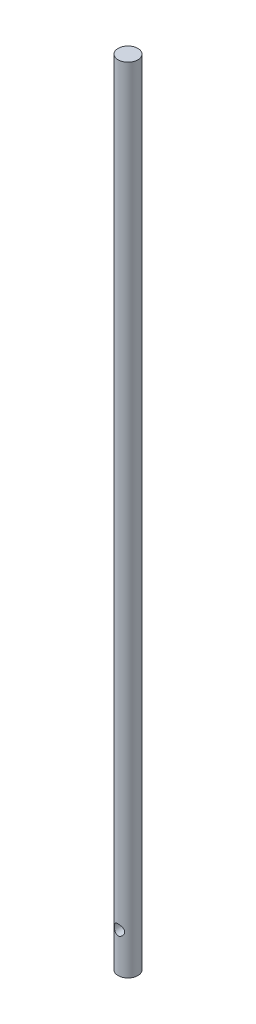
ISO-10303-21;
HEADER;
FILE_DESCRIPTION(('STEP AP214'),'2;1');
FILE_NAME('part.step','',(''),(''),'','','');
FILE_SCHEMA(('AUTOMOTIVE_DESIGN { 1 0 10303 214 1 1 1 1 }'));
ENDSEC;
DATA;
#1=APPLICATION_CONTEXT('core data for automotive mechanical design processes');
#2=APPLICATION_PROTOCOL_DEFINITION('international standard','automotive_design',2000,#1);
#3=PRODUCT_CONTEXT('',#1,'mechanical');
#4=PRODUCT('Part','Part','',(#3));
#5=PRODUCT_RELATED_PRODUCT_CATEGORY('part','',(#4));
#6=PRODUCT_DEFINITION_FORMATION('','',#4);
#7=PRODUCT_DEFINITION_CONTEXT('part definition',#1,'design');
#8=PRODUCT_DEFINITION('design','',#6,#7);
#9=PRODUCT_DEFINITION_SHAPE('','',#8);
#10=(LENGTH_UNIT() NAMED_UNIT(*) SI_UNIT(.MILLI.,.METRE.));
#11=(NAMED_UNIT(*) PLANE_ANGLE_UNIT() SI_UNIT($,.RADIAN.));
#12=(NAMED_UNIT(*) SI_UNIT($,.STERADIAN.) SOLID_ANGLE_UNIT());
#13=UNCERTAINTY_MEASURE_WITH_UNIT(LENGTH_MEASURE(1.E-05),#10,'distance_accuracy_value','');
#14=(GEOMETRIC_REPRESENTATION_CONTEXT(3) GLOBAL_UNCERTAINTY_ASSIGNED_CONTEXT((#13)) GLOBAL_UNIT_ASSIGNED_CONTEXT((#10,
#11,#12)) REPRESENTATION_CONTEXT('',''));
#15=CARTESIAN_POINT('',(0.,0.,0.));
#16=DIRECTION('',(0.,0.,1.));
#17=DIRECTION('',(1.,0.,0.));
#18=AXIS2_PLACEMENT_3D('',#15,#16,#17);
#19=CARTESIAN_POINT('',(0.,200.,0.));
#20=DIRECTION('',(0.,-1.,0.));
#21=DIRECTION('',(0.,0.,-1.));
#22=AXIS2_PLACEMENT_3D('',#19,#20,#21);
#23=CYLINDRICAL_SURFACE('',#22,2.5);
#24=CARTESIAN_POINT('',(0.,11.3,-2.5));
#25=CARTESIAN_POINT('',(-0.0680113695059631,11.2999955809797,-2.49999609902581));
#26=CARTESIAN_POINT('',(-0.136093788180356,11.2946316229765,-2.49719546987896));
#27=CARTESIAN_POINT('',(-0.270225454250748,11.273423033882,-2.48626765671663));
#28=CARTESIAN_POINT('',(-0.336271062711259,11.2575606668273,-2.47813145902996));
#29=CARTESIAN_POINT('',(-0.464188472425048,11.216154070548,-2.45737911115534));
#30=CARTESIAN_POINT('',(-0.526075766477188,11.1906484308444,-2.44478082944565));
#31=CARTESIAN_POINT('',(-0.644589209675041,11.1308906089619,-2.41624205813435));
#32=CARTESIAN_POINT('',(-0.701215505423523,11.0966386706068,-2.40030166170432));
#33=CARTESIAN_POINT('',(-0.81166759212663,11.0178831281098,-2.3653250117645));
#34=CARTESIAN_POINT('',(-0.865083381438265,10.9728643985277,-2.34615603866433));
#35=CARTESIAN_POINT('',(-0.963989056970096,10.8749705571644,-2.30728290736442));
#36=CARTESIAN_POINT('',(-1.00947237054757,10.8220889970174,-2.28757832084618));
#37=CARTESIAN_POINT('',(-1.09513753441025,10.7045584552035,-2.24790755636024));
#38=CARTESIAN_POINT('',(-1.13453247326665,10.639289699008,-2.22806332919205));
#39=CARTESIAN_POINT('',(-1.20162263947399,10.5019286437702,-2.19261300871779));
#40=CARTESIAN_POINT('',(-1.22932667033737,10.4298415293584,-2.17700372957641));
#41=CARTESIAN_POINT('',(-1.27036888654655,10.2853826193459,-2.15329918557366));
#42=CARTESIAN_POINT('',(-1.28448748494984,10.2133024027099,-2.1447999806986));
#43=CARTESIAN_POINT('',(-1.30032214599433,10.0673382991288,-2.13524197560196));
#44=CARTESIAN_POINT('',(-1.30205239339102,9.99345657226103,-2.13417466584282));
#45=CARTESIAN_POINT('',(-1.29363159633311,9.85649275191733,-2.13928164525275));
#46=CARTESIAN_POINT('',(-1.28501836836425,9.79327214308005,-2.14451886326309));
#47=CARTESIAN_POINT('',(-1.25884150775024,9.66934816643952,-2.15998772155474));
#48=CARTESIAN_POINT('',(-1.24127460315842,9.60864572762776,-2.17022118755991));
#49=CARTESIAN_POINT('',(-1.19739608727306,9.48975152758059,-2.19473990584834));
#50=CARTESIAN_POINT('',(-1.17089309730273,9.43164931861785,-2.20911272964634));
#51=CARTESIAN_POINT('',(-1.11004732855925,9.32042809671486,-2.24030417293869));
#52=CARTESIAN_POINT('',(-1.07570103709793,9.26731133163273,-2.2571238870646));
#53=CARTESIAN_POINT('',(-0.994600690710102,9.15981655563225,-2.29412683800401));
#54=CARTESIAN_POINT('',(-0.94678659795537,9.10628463283547,-2.31445310227271));
#55=CARTESIAN_POINT('',(-0.842817041578248,9.00762978696943,-2.35430677787375));
#56=CARTESIAN_POINT('',(-0.78665698079226,8.96251152943353,-2.3738337413228));
#57=CARTESIAN_POINT('',(-0.663774127410599,8.87965060642806,-2.41116994987061));
#58=CARTESIAN_POINT('',(-0.596644646812704,8.84243795998662,-2.4288294437478));
#59=CARTESIAN_POINT('',(-0.455930966123092,8.78015071661923,-2.45912356419007));
#60=CARTESIAN_POINT('',(-0.382352338507071,8.75506576037823,-2.47176247761752));
#61=CARTESIAN_POINT('',(-0.237696689390573,8.7199421707391,-2.48964687281174));
#62=CARTESIAN_POINT('',(-0.166960386836864,8.70878288196254,-2.49544064536842));
#63=CARTESIAN_POINT('',(-0.0243942042796414,8.6982683279208,-2.50089635599645));
#64=CARTESIAN_POINT('',(0.0474350713497855,8.69890676014066,-2.50056156803526));
#65=CARTESIAN_POINT('',(0.183618209438066,8.71137313423458,-2.49410050655221));
#66=CARTESIAN_POINT('',(0.248087136366193,8.72224207915056,-2.48847062394008));
#67=CARTESIAN_POINT('',(0.374141031441014,8.75331102944845,-2.47266151578169));
#68=CARTESIAN_POINT('',(0.435725691885608,8.77351202791539,-2.46248180606224));
#69=CARTESIAN_POINT('',(0.55618110520896,8.82313115942012,-2.43814302074764));
#70=CARTESIAN_POINT('',(0.614936096743494,8.85278017014389,-2.4238852987495));
#71=CARTESIAN_POINT('',(0.726817602279269,8.92018210792856,-2.39272108080907));
#72=CARTESIAN_POINT('',(0.779941812395783,8.95793833315712,-2.37581350761577));
#73=CARTESIAN_POINT('',(0.884925243858758,9.04499803288043,-2.33887075877338));
#74=CARTESIAN_POINT('',(0.936078033693247,9.09509413429453,-2.31869319367569));
#75=CARTESIAN_POINT('',(1.02959738484077,9.20310677159969,-2.27871043976582));
#76=CARTESIAN_POINT('',(1.07195663837658,9.26102974646841,-2.25890557300989));
#77=CARTESIAN_POINT('',(1.14910272035529,9.38733673410915,-2.22070397734203));
#78=CARTESIAN_POINT('',(1.18328973831135,9.45613791542058,-2.20246093456135));
#79=CARTESIAN_POINT('',(1.23924098239167,9.59975141512398,-2.17147835100918));
#80=CARTESIAN_POINT('',(1.26102233570193,9.67455528255512,-2.15873122854439));
#81=CARTESIAN_POINT('',(1.28943999012578,9.82027124591388,-2.14186687422015));
#82=CARTESIAN_POINT('',(1.29734839119878,9.89084921061157,-2.13702798664101));
#83=CARTESIAN_POINT('',(1.3015203399281,10.0324609798733,-2.13449180299613));
#84=CARTESIAN_POINT('',(1.29779049988741,10.1034945027235,-2.13679045171325));
#85=CARTESIAN_POINT('',(1.2800034542772,10.2356761059305,-2.14748109373078));
#86=CARTESIAN_POINT('',(1.26713384169057,10.2970487331319,-2.15517118633996));
#87=CARTESIAN_POINT('',(1.23298733247354,10.4166697799384,-2.17488587021126));
#88=CARTESIAN_POINT('',(1.21170751826452,10.4749171073746,-2.18691196554666));
#89=CARTESIAN_POINT('',(1.15979270017153,10.5909175599503,-2.21490467413759));
#90=CARTESIAN_POINT('',(1.12863261878603,10.6483839298456,-2.23107909446047));
#91=CARTESIAN_POINT('',(1.05838667201273,10.7576554103908,-2.2652468080127));
#92=CARTESIAN_POINT('',(1.01929655715553,10.8094574626985,-2.28324107383964));
#93=CARTESIAN_POINT('',(0.928121386241809,10.9132263220494,-2.3219301192689));
#94=CARTESIAN_POINT('',(0.874994006967033,10.9642688719206,-2.34266114669507));
#95=CARTESIAN_POINT('',(0.760430106723436,11.0569653962801,-2.38231377154673));
#96=CARTESIAN_POINT('',(0.698988646857169,11.09861375072,-2.40123428195996));
#97=CARTESIAN_POINT('',(0.567986350348215,11.1717994003664,-2.43558032718761));
#98=CARTESIAN_POINT('',(0.498306712219092,11.2031555742418,-2.45094198545967));
#99=CARTESIAN_POINT('',(0.353697863564509,11.2532825710194,-2.47593211426922));
#100=CARTESIAN_POINT('',(0.278783693118586,11.2720879357208,-2.48557631190442));
#101=CARTESIAN_POINT('',(0.169188039913598,11.2893907930656,-2.49449662438316));
#102=CARTESIAN_POINT('',(0.13551306404705,11.2933625590737,-2.49655400233432));
#103=CARTESIAN_POINT('',(0.067897966914962,11.2986682957714,-2.49930667952064));
#104=CARTESIAN_POINT('',(0.0339578396300279,11.3000022064014,-2.50000194774281));
#105=CARTESIAN_POINT('',(0.,11.3,-2.5));
#106=B_SPLINE_CURVE_WITH_KNOTS('',3,(#24,#25,#26,#27,#28,#29,#30,#31,#32,#33,#34,#35,#36,#37,
#38,#39,#40,#41,#42,#43,#44,#45,#46,#47,#48,#49,#50,#51,#52,#53,#54,#55,#56,#57,#58,#59,#60,#61,
#62,#63,#64,#65,#66,#67,#68,#69,#70,#71,#72,#73,#74,#75,#76,#77,#78,#79,#80,#81,#82,#83,#84,#85,
#86,#87,#88,#89,#90,#91,#92,#93,#94,#95,#96,#97,#98,#99,#100,#101,#102,#103,#104,#105),
.UNSPECIFIED.,.T.,.F.,(4,2,2,2,2,2,2,2,2,2,2,2,2,2,2,2,2,2,2,2,2,2,2,2,2,2,2,2,2,2,2,2,2,2,2,2,
2,2,2,2,4),(0.,0.203896806366285,0.408138957322479,0.611572296877393,0.814999965865628,
1.03142326439271,1.24802504237353,1.48316517792176,1.71812793040786,1.93860407014476,
2.15882772260557,2.34998891208855,2.54122000784162,2.73683841649128,2.9325446069,
3.15538331852189,3.37834523326736,3.6133502261928,3.84815412468367,4.06249724663536,
4.27672586667119,4.47268293759257,4.66866086639621,4.86985169558171,5.07112452858474,
5.2933343320654,5.51572806791228,5.75134168970872,5.98662923131482,6.19892188281192,
6.41109394154319,6.599804305942,6.78858019329843,6.98982480284757,7.19117753962887,
7.4197479326573,7.64845470667187,7.88099383218265,8.1128903049696,8.21469295152371,
8.31649791592829),.UNSPECIFIED.);
#107=CARTESIAN_POINT('',(0.,11.3,-2.5));
#108=VERTEX_POINT('',#107);
#109=EDGE_CURVE('E10',#108,#108,#106,.T.);
#110=ORIENTED_EDGE('',*,*,#109,.T.);
#111=EDGE_LOOP('',(#110));
#112=FACE_BOUND('',#111,.T.);
#113=CARTESIAN_POINT('',(1.3,10.,2.13541565040627));
#114=CARTESIAN_POINT('',(1.29999499202181,9.93269100075459,2.13542218510378));
#115=CARTESIAN_POINT('',(1.29473701672371,9.86530685608975,2.13864723650628));
#116=CARTESIAN_POINT('',(1.27398927979969,9.73264180439464,2.15106664383973));
#117=CARTESIAN_POINT('',(1.25847975439629,9.66736521594842,2.1602725295249));
#118=CARTESIAN_POINT('',(1.21810181079737,9.54108954043734,2.18329096498212));
#119=CARTESIAN_POINT('',(1.19328638783913,9.48006850959343,2.19707737979651));
#120=CARTESIAN_POINT('',(1.13516352123659,9.36307323514826,2.22766227770051));
#121=CARTESIAN_POINT('',(1.10185505167651,9.30709960235286,2.24446112460342));
#122=CARTESIAN_POINT('',(1.02419532044111,9.19625635015196,2.2810137465525));
#123=CARTESIAN_POINT('',(0.979121896827735,9.14193530864805,2.30089741785951));
#124=CARTESIAN_POINT('',(0.880709450271071,9.04119172852187,2.34033381565221));
#125=CARTESIAN_POINT('',(0.827366033575871,8.99477341619444,2.35988636005305));
#126=CARTESIAN_POINT('',(0.70908553888755,8.90776535204113,2.39819471975978));
#127=CARTESIAN_POINT('',(0.643581229035659,8.86786597293379,2.41678309039593));
#128=CARTESIAN_POINT('',(0.505641388544539,8.79990603852961,2.44935371352648));
#129=CARTESIAN_POINT('',(0.433210624601339,8.77183741237837,2.46333910470838));
#130=CARTESIAN_POINT('',(0.289298945506804,8.73056076602125,2.48418681583152));
#131=CARTESIAN_POINT('',(0.218163460154728,8.71638624591816,2.49150934080119));
#132=CARTESIAN_POINT('',(0.0741778008891665,8.70010130033559,2.49993700304784));
#133=CARTESIAN_POINT('',(0.00132879562041733,8.69798287901473,2.50104626107773));
#134=CARTESIAN_POINT('',(-0.136682456405424,8.70553406154927,2.49712573383651));
#135=CARTESIAN_POINT('',(-0.201924315538508,8.71411573490751,2.49266247499283));
#136=CARTESIAN_POINT('',(-0.329885993888209,8.74085424661549,2.47897486045309));
#137=CARTESIAN_POINT('',(-0.392605622438354,8.75901180738965,2.46975014554423));
#138=CARTESIAN_POINT('',(-0.514777576681894,8.80446269517812,2.44722620871872));
#139=CARTESIAN_POINT('',(-0.574177681565646,8.83187020447115,2.43387624736632));
#140=CARTESIAN_POINT('',(-0.687669921056,8.89486328437445,2.40427842476177));
#141=CARTESIAN_POINT('',(-0.741760209420255,8.9304516852382,2.3880295610447));
#142=CARTESIAN_POINT('',(-0.848875674255684,9.01287163365255,2.35221370900834));
#143=CARTESIAN_POINT('',(-0.901253228298807,9.0604716841809,2.33247739567263));
#144=CARTESIAN_POINT('',(-0.99764619149215,9.16352690745745,2.29290702169619));
#145=CARTESIAN_POINT('',(-1.04165426010071,9.21898890188274,2.27307289076016));
#146=CARTESIAN_POINT('',(-1.12321984532313,9.34109920091927,2.23395831464773));
#147=CARTESIAN_POINT('',(-1.16007544362623,9.40826770686471,2.21482304995731));
#148=CARTESIAN_POINT('',(-1.22169363677282,9.54905493191469,2.18144537006634));
#149=CARTESIAN_POINT('',(-1.24646958145131,9.62266642390193,2.16719755868201));
#150=CARTESIAN_POINT('',(-1.28113869349278,9.76804179066204,2.14687223354657));
#151=CARTESIAN_POINT('',(-1.29207210047855,9.83947486439331,2.14022786744823));
#152=CARTESIAN_POINT('',(-1.30189057145277,9.98344415250228,2.13427299745983));
#153=CARTESIAN_POINT('',(-1.30078590562577,10.0559793738337,2.13495624207002));
#154=CARTESIAN_POINT('',(-1.28751419422176,10.1905525909655,2.14297632381999));
#155=CARTESIAN_POINT('',(-1.27672416536976,10.2527845989002,2.14948465404406));
#156=CARTESIAN_POINT('',(-1.24649206812443,10.3744154013213,2.16715522437387));
#157=CARTESIAN_POINT('',(-1.22704687428943,10.4338131637549,2.17831914555465));
#158=CARTESIAN_POINT('',(-1.17915135897731,10.551183419197,2.20462633850681));
#159=CARTESIAN_POINT('',(-1.15033209571267,10.6089685989489,2.2199273394449));
#160=CARTESIAN_POINT('',(-1.08481983617793,10.7192241001006,2.25266652106441));
#161=CARTESIAN_POINT('',(-1.04812279157547,10.7716916683347,2.27010579860658));
#162=CARTESIAN_POINT('',(-0.961968585041581,10.8774324310823,2.3080563653285));
#163=CARTESIAN_POINT('',(-0.911448064320804,10.9298106825179,2.32865859376251));
#164=CARTESIAN_POINT('',(-0.802069969538994,11.0256575346832,2.36855930108251));
#165=CARTESIAN_POINT('',(-0.743208834810625,11.0691223106919,2.38785721792472));
#166=CARTESIAN_POINT('',(-0.616079757666162,11.1472577919734,2.42383055698205));
#167=CARTESIAN_POINT('',(-0.547554418399362,11.1815668700677,2.44039035375406));
#168=CARTESIAN_POINT('',(-0.40459604190418,11.2378151846433,2.46811344440668));
#169=CARTESIAN_POINT('',(-0.330168669217798,11.259766121915,2.47928184147595));
#170=CARTESIAN_POINT('',(-0.185242302436258,11.2886464619741,2.49408770335634));
#171=CARTESIAN_POINT('',(-0.115054090191299,11.2968176973625,2.49834623904765));
#172=CARTESIAN_POINT('',(0.0258139751293504,11.3016503525928,2.50085731835905));
#173=CARTESIAN_POINT('',(0.096493613440357,11.2983165192592,2.49911233894338));
#174=CARTESIAN_POINT('',(0.230745025430368,11.2810131453441,2.4901702321934));
#175=CARTESIAN_POINT('',(0.294452891678614,11.2678581948142,2.48339088692572));
#176=CARTESIAN_POINT('',(0.418632589796487,11.2324436062964,2.46549879631305));
#177=CARTESIAN_POINT('',(0.479103990198096,11.2101827577616,2.45438547481431));
#178=CARTESIAN_POINT('',(0.597836427433064,11.1562926942939,2.42825778950366));
#179=CARTESIAN_POINT('',(0.655911969712632,11.1243240115459,2.41310502617537));
#180=CARTESIAN_POINT('',(0.766098965877374,11.0523442918901,2.38042028457294));
#181=CARTESIAN_POINT('',(0.818207739555164,11.0123296628999,2.36288724477302));
#182=CARTESIAN_POINT('',(0.920833636857412,10.9204878123107,2.3249443700486));
#183=CARTESIAN_POINT('',(0.970593729651148,10.8678573195916,2.30442678436291));
#184=CARTESIAN_POINT('',(1.06089570237737,10.754810450567,2.2642766092094));
#185=CARTESIAN_POINT('',(1.10142823987707,10.6943862796372,2.24464493265648));
#186=CARTESIAN_POINT('',(1.1737478150068,10.564019263506,2.20772266788278));
#187=CARTESIAN_POINT('',(1.20506480327902,10.4937722879421,2.19057533563931));
#188=CARTESIAN_POINT('',(1.25494868861381,10.3478534410444,2.16239301738629));
#189=CARTESIAN_POINT('',(1.27355781297327,10.2722004684451,2.15133781156507));
#190=CARTESIAN_POINT('',(1.29015276550731,10.1630190071715,2.14138529642277));
#191=CARTESIAN_POINT('',(1.29383860106907,10.1305724586167,2.1391563394257));
#192=CARTESIAN_POINT('',(1.29876350890652,10.0654232028883,2.13616988397473));
#193=CARTESIAN_POINT('',(1.30000243449545,10.0327204804756,2.1354124737368));
#194=CARTESIAN_POINT('',(1.3,10.,2.13541565040627));
#195=B_SPLINE_CURVE_WITH_KNOTS('',3,(#113,#114,#115,#116,#117,#118,#119,#120,#121,#122,#123,
#124,#125,#126,#127,#128,#129,#130,#131,#132,#133,#134,#135,#136,#137,#138,#139,#140,#141,#142,
#143,#144,#145,#146,#147,#148,#149,#150,#151,#152,#153,#154,#155,#156,#157,#158,#159,#160,#161,
#162,#163,#164,#165,#166,#167,#168,#169,#170,#171,#172,#173,#174,#175,#176,#177,#178,#179,#180,
#181,#182,#183,#184,#185,#186,#187,#188,#189,#190,#191,#192,#193,#194),.UNSPECIFIED.,.T.,.F.,(4,
2,2,2,2,2,2,2,2,2,2,2,2,2,2,2,2,2,2,2,2,2,2,2,2,2,2,2,2,2,2,2,2,2,2,2,2,2,2,2,4),(0.,
0.201788971065216,0.403968106542995,0.605012937933445,0.806082066006086,1.02517227871208,
1.24437929295831,1.47989162110131,1.71524302336943,1.93272508282477,2.15006288708459,
2.34699813827084,2.54394824877845,2.74342430450679,2.9429694749196,3.16247266084571,
3.38216748527563,3.6178404109721,3.85325228889403,4.06965447485715,4.28587205350762,
4.4755018992601,4.66520027732351,4.86351590529131,5.06193369117709,5.28783344329277,
5.51382992579938,5.74774755473539,5.98144333443802,6.19265964442112,6.40378882003653,
6.59911820999192,6.79447357566489,6.99765218194362,7.20092169875522,7.4257831250155,
7.65087120953729,7.88598682814921,8.12031732272595,8.21840578615212,8.3165001295825),.UNSPECIFIED.);
#196=CARTESIAN_POINT('',(1.3,10.,2.13541565040627));
#197=VERTEX_POINT('',#196);
#198=EDGE_CURVE('E42',#197,#197,#195,.T.);
#199=ORIENTED_EDGE('',*,*,#198,.T.);
#200=EDGE_LOOP('',(#199));
#201=FACE_BOUND('',#200,.T.);
#202=CARTESIAN_POINT('',(0.,200.,0.));
#203=DIRECTION('',(0.,1.,0.));
#204=DIRECTION('',(0.,0.,1.));
#205=AXIS2_PLACEMENT_3D('',#202,#203,#204);
#206=CIRCLE('',#205,2.5);
#207=CARTESIAN_POINT('',(0.,200.,2.5));
#208=VERTEX_POINT('',#207);
#209=EDGE_CURVE('E46',#208,#208,#206,.T.);
#210=ORIENTED_EDGE('',*,*,#209,.F.);
#211=EDGE_LOOP('',(#210));
#212=FACE_BOUND('',#211,.T.);
#213=CARTESIAN_POINT('',(0.,0.,0.));
#214=DIRECTION('',(0.,1.,0.));
#215=DIRECTION('',(0.,0.,1.));
#216=AXIS2_PLACEMENT_3D('',#213,#214,#215);
#217=CIRCLE('',#216,2.5);
#218=CARTESIAN_POINT('',(0.,0.,2.5));
#219=VERTEX_POINT('',#218);
#220=EDGE_CURVE('E50',#219,#219,#217,.T.);
#221=ORIENTED_EDGE('',*,*,#220,.T.);
#222=EDGE_LOOP('',(#221));
#223=FACE_BOUND('',#222,.T.);
#224=ADVANCED_FACE('F31',(#112,#201,#212,#223),#23,.T.);
#225=CARTESIAN_POINT('',(0.,200.,0.));
#226=DIRECTION('',(0.,1.,0.));
#227=DIRECTION('',(0.,0.,1.));
#228=AXIS2_PLACEMENT_3D('',#225,#226,#227);
#229=PLANE('',#228);
#230=ORIENTED_EDGE('',*,*,#209,.T.);
#231=EDGE_LOOP('',(#230));
#232=FACE_BOUND('',#231,.T.);
#233=ADVANCED_FACE('F62',(#232),#229,.T.);
#234=CARTESIAN_POINT('',(0.,0.,0.));
#235=DIRECTION('',(0.,1.,0.));
#236=DIRECTION('',(0.,0.,1.));
#237=AXIS2_PLACEMENT_3D('',#234,#235,#236);
#238=PLANE('',#237);
#239=ORIENTED_EDGE('',*,*,#220,.F.);
#240=EDGE_LOOP('',(#239));
#241=FACE_BOUND('',#240,.T.);
#242=ADVANCED_FACE('F60',(#241),#238,.F.);
#243=CARTESIAN_POINT('',(0.,10.,-2.5));
#244=DIRECTION('',(0.,0.,1.));
#245=DIRECTION('',(1.,0.,0.));
#246=AXIS2_PLACEMENT_3D('',#243,#244,#245);
#247=CYLINDRICAL_SURFACE('',#246,1.3);
#248=ORIENTED_EDGE('',*,*,#198,.F.);
#249=EDGE_LOOP('',(#248));
#250=FACE_BOUND('',#249,.T.);
#251=ORIENTED_EDGE('',*,*,#109,.F.);
#252=EDGE_LOOP('',(#251));
#253=FACE_BOUND('',#252,.T.);
#254=ADVANCED_FACE('F56',(#250,#253),#247,.F.);
#255=CLOSED_SHELL('',(#224,#233,#242,#254));
#256=MANIFOLD_SOLID_BREP('B2',#255);
#257=ADVANCED_BREP_SHAPE_REPRESENTATION('',(#18,#256),#14);
#258=SHAPE_DEFINITION_REPRESENTATION(#9,#257);
ENDSEC;
END-ISO-10303-21;
